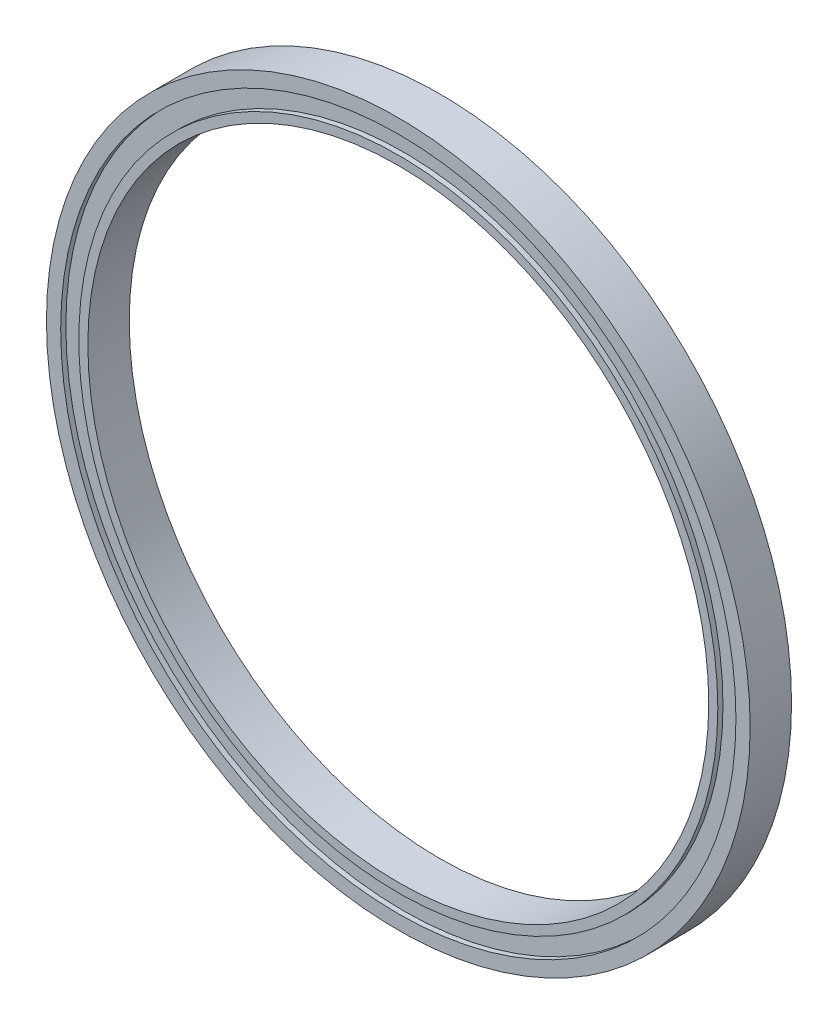
ISO-10303-21;
HEADER;
FILE_DESCRIPTION(('STEP AP214'),'2;1');
FILE_NAME('part.step','',(''),(''),'','','');
FILE_SCHEMA(('AUTOMOTIVE_DESIGN { 1 0 10303 214 1 1 1 1 }'));
ENDSEC;
DATA;
#1=APPLICATION_CONTEXT('core data for automotive mechanical design processes');
#2=APPLICATION_PROTOCOL_DEFINITION('international standard','automotive_design',2000,#1);
#3=PRODUCT_CONTEXT('',#1,'mechanical');
#4=PRODUCT('Part','Part','',(#3));
#5=PRODUCT_RELATED_PRODUCT_CATEGORY('part','',(#4));
#6=PRODUCT_DEFINITION_FORMATION('','',#4);
#7=PRODUCT_DEFINITION_CONTEXT('part definition',#1,'design');
#8=PRODUCT_DEFINITION('design','',#6,#7);
#9=PRODUCT_DEFINITION_SHAPE('','',#8);
#10=(LENGTH_UNIT() NAMED_UNIT(*) SI_UNIT(.MILLI.,.METRE.));
#11=(NAMED_UNIT(*) PLANE_ANGLE_UNIT() SI_UNIT($,.RADIAN.));
#12=(NAMED_UNIT(*) SI_UNIT($,.STERADIAN.) SOLID_ANGLE_UNIT());
#13=UNCERTAINTY_MEASURE_WITH_UNIT(LENGTH_MEASURE(1.E-05),#10,'distance_accuracy_value','');
#14=(GEOMETRIC_REPRESENTATION_CONTEXT(3) GLOBAL_UNCERTAINTY_ASSIGNED_CONTEXT((#13)) GLOBAL_UNIT_ASSIGNED_CONTEXT((#10,
#11,#12)) REPRESENTATION_CONTEXT('',''));
#15=CARTESIAN_POINT('',(0.,0.,0.));
#16=DIRECTION('',(0.,0.,1.));
#17=DIRECTION('',(1.,0.,0.));
#18=AXIS2_PLACEMENT_3D('',#15,#16,#17);
#19=CARTESIAN_POINT('',(0.,0.,0.));
#20=DIRECTION('',(0.,0.,1.));
#21=DIRECTION('',(1.,0.,0.));
#22=AXIS2_PLACEMENT_3D('',#19,#20,#21);
#23=PLANE('',#22);
#24=CARTESIAN_POINT('',(0.,0.,0.));
#25=DIRECTION('',(0.,0.,1.));
#26=DIRECTION('',(1.,0.,0.));
#27=AXIS2_PLACEMENT_3D('',#24,#25,#26);
#28=CIRCLE('',#27,60.);
#29=CARTESIAN_POINT('',(60.,0.,0.));
#30=VERTEX_POINT('',#29);
#31=EDGE_CURVE('E50',#30,#30,#28,.T.);
#32=ORIENTED_EDGE('',*,*,#31,.T.);
#33=EDGE_LOOP('',(#32));
#34=FACE_BOUND('',#33,.T.);
#35=CARTESIAN_POINT('',(0.,0.,0.));
#36=DIRECTION('',(0.,0.,-1.));
#37=DIRECTION('',(-1.,0.,0.));
#38=AXIS2_PLACEMENT_3D('',#35,#36,#37);
#39=CIRCLE('',#38,61.75);
#40=CARTESIAN_POINT('',(-61.75,0.,0.));
#41=VERTEX_POINT('',#40);
#42=EDGE_CURVE('E74',#41,#41,#39,.T.);
#43=ORIENTED_EDGE('',*,*,#42,.T.);
#44=EDGE_LOOP('',(#43));
#45=FACE_BOUND('',#44,.T.);
#46=ADVANCED_FACE('F37',(#34,#45),#23,.F.);
#47=CARTESIAN_POINT('',(0.,0.,8.));
#48=DIRECTION('',(0.,0.,1.));
#49=DIRECTION('',(1.,0.,0.));
#50=AXIS2_PLACEMENT_3D('',#47,#48,#49);
#51=PLANE('',#50);
#52=CARTESIAN_POINT('',(0.,0.,8.));
#53=DIRECTION('',(0.,0.,1.));
#54=DIRECTION('',(1.,0.,0.));
#55=AXIS2_PLACEMENT_3D('',#52,#53,#54);
#56=CIRCLE('',#55,60.);
#57=CARTESIAN_POINT('',(60.,0.,8.));
#58=VERTEX_POINT('',#57);
#59=EDGE_CURVE('E48',#58,#58,#56,.T.);
#60=ORIENTED_EDGE('',*,*,#59,.F.);
#61=EDGE_LOOP('',(#60));
#62=FACE_BOUND('',#61,.T.);
#63=CARTESIAN_POINT('',(0.,0.,8.));
#64=DIRECTION('',(0.,0.,1.));
#65=DIRECTION('',(1.,0.,0.));
#66=AXIS2_PLACEMENT_3D('',#63,#64,#65);
#67=CIRCLE('',#66,61.75);
#68=CARTESIAN_POINT('',(61.75,0.,8.));
#69=VERTEX_POINT('',#68);
#70=EDGE_CURVE('E62',#69,#69,#67,.T.);
#71=ORIENTED_EDGE('',*,*,#70,.T.);
#72=EDGE_LOOP('',(#71));
#73=FACE_BOUND('',#72,.T.);
#74=ADVANCED_FACE('F112',(#62,#73),#51,.T.);
#75=CARTESIAN_POINT('',(0.,0.,8.));
#76=DIRECTION('',(0.,0.,1.));
#77=DIRECTION('',(1.,0.,0.));
#78=AXIS2_PLACEMENT_3D('',#75,#76,#77);
#79=CIRCLE('',#78,65.25);
#80=CARTESIAN_POINT('',(65.25,0.,8.));
#81=VERTEX_POINT('',#80);
#82=EDGE_CURVE('E56',#81,#81,#79,.T.);
#83=ORIENTED_EDGE('',*,*,#82,.F.);
#84=EDGE_LOOP('',(#83));
#85=FACE_BOUND('',#84,.T.);
#86=CARTESIAN_POINT('',(0.,0.,8.));
#87=DIRECTION('',(0.,0.,1.));
#88=DIRECTION('',(1.,0.,0.));
#89=AXIS2_PLACEMENT_3D('',#86,#87,#88);
#90=CIRCLE('',#89,68.);
#91=CARTESIAN_POINT('',(68.,0.,8.));
#92=VERTEX_POINT('',#91);
#93=EDGE_CURVE('E10',#92,#92,#90,.T.);
#94=ORIENTED_EDGE('',*,*,#93,.T.);
#95=EDGE_LOOP('',(#94));
#96=FACE_BOUND('',#95,.T.);
#97=ADVANCED_FACE('F99',(#85,#96),#51,.T.);
#98=CARTESIAN_POINT('',(0.,0.,0.));
#99=DIRECTION('',(0.,0.,-1.));
#100=DIRECTION('',(-1.,0.,0.));
#101=AXIS2_PLACEMENT_3D('',#98,#99,#100);
#102=CIRCLE('',#101,65.25);
#103=CARTESIAN_POINT('',(-65.25,0.,0.));
#104=VERTEX_POINT('',#103);
#105=EDGE_CURVE('E68',#104,#104,#102,.T.);
#106=ORIENTED_EDGE('',*,*,#105,.F.);
#107=EDGE_LOOP('',(#106));
#108=FACE_BOUND('',#107,.T.);
#109=CARTESIAN_POINT('',(0.,0.,0.));
#110=DIRECTION('',(0.,0.,1.));
#111=DIRECTION('',(1.,0.,0.));
#112=AXIS2_PLACEMENT_3D('',#109,#110,#111);
#113=CIRCLE('',#112,68.);
#114=CARTESIAN_POINT('',(68.,0.,0.));
#115=VERTEX_POINT('',#114);
#116=EDGE_CURVE('E41',#115,#115,#113,.T.);
#117=ORIENTED_EDGE('',*,*,#116,.F.);
#118=EDGE_LOOP('',(#117));
#119=FACE_BOUND('',#118,.T.);
#120=ADVANCED_FACE('F96',(#108,#119),#23,.F.);
#121=CARTESIAN_POINT('',(0.,0.,8.));
#122=DIRECTION('',(0.,0.,-1.));
#123=DIRECTION('',(-1.,0.,0.));
#124=AXIS2_PLACEMENT_3D('',#121,#122,#123);
#125=CYLINDRICAL_SURFACE('',#124,68.);
#126=ORIENTED_EDGE('',*,*,#93,.F.);
#127=EDGE_LOOP('',(#126));
#128=FACE_BOUND('',#127,.T.);
#129=ORIENTED_EDGE('',*,*,#116,.T.);
#130=EDGE_LOOP('',(#129));
#131=FACE_BOUND('',#130,.T.);
#132=ADVANCED_FACE('F39',(#128,#131),#125,.T.);
#133=CARTESIAN_POINT('',(0.,0.,8.));
#134=DIRECTION('',(0.,0.,-1.));
#135=DIRECTION('',(-1.,0.,0.));
#136=AXIS2_PLACEMENT_3D('',#133,#134,#135);
#137=CYLINDRICAL_SURFACE('',#136,60.);
#138=ORIENTED_EDGE('',*,*,#59,.T.);
#139=EDGE_LOOP('',(#138));
#140=FACE_BOUND('',#139,.T.);
#141=ORIENTED_EDGE('',*,*,#31,.F.);
#142=EDGE_LOOP('',(#141));
#143=FACE_BOUND('',#142,.T.);
#144=ADVANCED_FACE('F103',(#140,#143),#137,.F.);
#145=CARTESIAN_POINT('',(0.,0.,7.));
#146=DIRECTION('',(0.,0.,1.));
#147=DIRECTION('',(1.,0.,0.));
#148=AXIS2_PLACEMENT_3D('',#145,#146,#147);
#149=CYLINDRICAL_SURFACE('',#148,65.25);
#150=CARTESIAN_POINT('',(0.,0.,7.));
#151=DIRECTION('',(0.,0.,1.));
#152=DIRECTION('',(1.,0.,0.));
#153=AXIS2_PLACEMENT_3D('',#150,#151,#152);
#154=CIRCLE('',#153,65.25);
#155=CARTESIAN_POINT('',(65.25,0.,7.));
#156=VERTEX_POINT('',#155);
#157=EDGE_CURVE('E53',#156,#156,#154,.T.);
#158=ORIENTED_EDGE('',*,*,#157,.F.);
#159=EDGE_LOOP('',(#158));
#160=FACE_BOUND('',#159,.T.);
#161=ORIENTED_EDGE('',*,*,#82,.T.);
#162=EDGE_LOOP('',(#161));
#163=FACE_BOUND('',#162,.T.);
#164=ADVANCED_FACE('F108',(#160,#163),#149,.F.);
#165=CARTESIAN_POINT('',(0.,0.,7.));
#166=DIRECTION('',(0.,0.,1.));
#167=DIRECTION('',(1.,0.,0.));
#168=AXIS2_PLACEMENT_3D('',#165,#166,#167);
#169=PLANE('',#168);
#170=CARTESIAN_POINT('',(0.,0.,7.));
#171=DIRECTION('',(0.,0.,1.));
#172=DIRECTION('',(1.,0.,0.));
#173=AXIS2_PLACEMENT_3D('',#170,#171,#172);
#174=CIRCLE('',#173,61.75);
#175=CARTESIAN_POINT('',(61.75,0.,7.));
#176=VERTEX_POINT('',#175);
#177=EDGE_CURVE('E59',#176,#176,#174,.T.);
#178=ORIENTED_EDGE('',*,*,#177,.F.);
#179=EDGE_LOOP('',(#178));
#180=FACE_BOUND('',#179,.T.);
#181=ORIENTED_EDGE('',*,*,#157,.T.);
#182=EDGE_LOOP('',(#181));
#183=FACE_BOUND('',#182,.T.);
#184=ADVANCED_FACE('F125',(#180,#183),#169,.T.);
#185=CARTESIAN_POINT('',(0.,0.,7.));
#186=DIRECTION('',(0.,0.,1.));
#187=DIRECTION('',(1.,0.,0.));
#188=AXIS2_PLACEMENT_3D('',#185,#186,#187);
#189=CYLINDRICAL_SURFACE('',#188,61.75);
#190=ORIENTED_EDGE('',*,*,#177,.T.);
#191=EDGE_LOOP('',(#190));
#192=FACE_BOUND('',#191,.T.);
#193=ORIENTED_EDGE('',*,*,#70,.F.);
#194=EDGE_LOOP('',(#193));
#195=FACE_BOUND('',#194,.T.);
#196=ADVANCED_FACE('F92',(#192,#195),#189,.T.);
#197=CARTESIAN_POINT('',(0.,0.,1.));
#198=DIRECTION('',(0.,0.,-1.));
#199=DIRECTION('',(-1.,0.,0.));
#200=AXIS2_PLACEMENT_3D('',#197,#198,#199);
#201=CYLINDRICAL_SURFACE('',#200,65.25);
#202=CARTESIAN_POINT('',(0.,0.,1.));
#203=DIRECTION('',(0.,0.,-1.));
#204=DIRECTION('',(-1.,0.,0.));
#205=AXIS2_PLACEMENT_3D('',#202,#203,#204);
#206=CIRCLE('',#205,65.25);
#207=CARTESIAN_POINT('',(-65.25,0.,1.));
#208=VERTEX_POINT('',#207);
#209=EDGE_CURVE('E65',#208,#208,#206,.T.);
#210=ORIENTED_EDGE('',*,*,#209,.F.);
#211=EDGE_LOOP('',(#210));
#212=FACE_BOUND('',#211,.T.);
#213=ORIENTED_EDGE('',*,*,#105,.T.);
#214=EDGE_LOOP('',(#213));
#215=FACE_BOUND('',#214,.T.);
#216=ADVANCED_FACE('F86',(#212,#215),#201,.F.);
#217=CARTESIAN_POINT('',(0.,0.,1.));
#218=DIRECTION('',(0.,0.,-1.));
#219=DIRECTION('',(-1.,0.,0.));
#220=AXIS2_PLACEMENT_3D('',#217,#218,#219);
#221=PLANE('',#220);
#222=CARTESIAN_POINT('',(0.,0.,1.));
#223=DIRECTION('',(0.,0.,-1.));
#224=DIRECTION('',(-1.,0.,0.));
#225=AXIS2_PLACEMENT_3D('',#222,#223,#224);
#226=CIRCLE('',#225,61.75);
#227=CARTESIAN_POINT('',(-61.75,0.,1.));
#228=VERTEX_POINT('',#227);
#229=EDGE_CURVE('E71',#228,#228,#226,.T.);
#230=ORIENTED_EDGE('',*,*,#229,.F.);
#231=EDGE_LOOP('',(#230));
#232=FACE_BOUND('',#231,.T.);
#233=ORIENTED_EDGE('',*,*,#209,.T.);
#234=EDGE_LOOP('',(#233));
#235=FACE_BOUND('',#234,.T.);
#236=ADVANCED_FACE('F83',(#232,#235),#221,.T.);
#237=CARTESIAN_POINT('',(0.,0.,1.));
#238=DIRECTION('',(0.,0.,-1.));
#239=DIRECTION('',(-1.,0.,0.));
#240=AXIS2_PLACEMENT_3D('',#237,#238,#239);
#241=CYLINDRICAL_SURFACE('',#240,61.75);
#242=ORIENTED_EDGE('',*,*,#229,.T.);
#243=EDGE_LOOP('',(#242));
#244=FACE_BOUND('',#243,.T.);
#245=ORIENTED_EDGE('',*,*,#42,.F.);
#246=EDGE_LOOP('',(#245));
#247=FACE_BOUND('',#246,.T.);
#248=ADVANCED_FACE('F80',(#244,#247),#241,.T.);
#249=CLOSED_SHELL('',(#46,#74,#97,#120,#132,#144,#164,#184,#196,#216,#236,#248));
#250=MANIFOLD_SOLID_BREP('B2',#249);
#251=ADVANCED_BREP_SHAPE_REPRESENTATION('',(#18,#250),#14);
#252=SHAPE_DEFINITION_REPRESENTATION(#9,#251);
ENDSEC;
END-ISO-10303-21;
